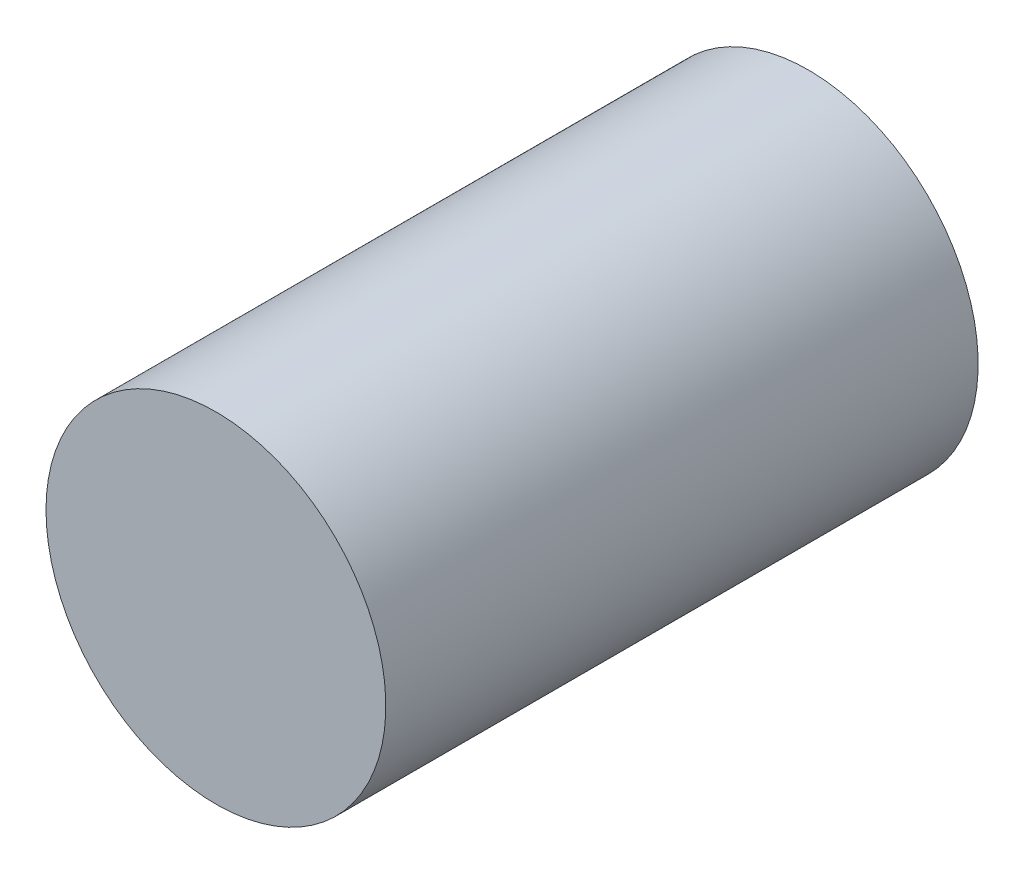
ISO-10303-21;
HEADER;
FILE_DESCRIPTION(('STEP AP214'),'2;1');
FILE_NAME('part.step','',(''),(''),'','','');
FILE_SCHEMA(('AUTOMOTIVE_DESIGN { 1 0 10303 214 1 1 1 1 }'));
ENDSEC;
DATA;
#1=APPLICATION_CONTEXT('core data for automotive mechanical design processes');
#2=APPLICATION_PROTOCOL_DEFINITION('international standard','automotive_design',2000,#1);
#3=PRODUCT_CONTEXT('',#1,'mechanical');
#4=PRODUCT('Part','Part','',(#3));
#5=PRODUCT_RELATED_PRODUCT_CATEGORY('part','',(#4));
#6=PRODUCT_DEFINITION_FORMATION('','',#4);
#7=PRODUCT_DEFINITION_CONTEXT('part definition',#1,'design');
#8=PRODUCT_DEFINITION('design','',#6,#7);
#9=PRODUCT_DEFINITION_SHAPE('','',#8);
#10=(LENGTH_UNIT() NAMED_UNIT(*) SI_UNIT(.MILLI.,.METRE.));
#11=(NAMED_UNIT(*) PLANE_ANGLE_UNIT() SI_UNIT($,.RADIAN.));
#12=(NAMED_UNIT(*) SI_UNIT($,.STERADIAN.) SOLID_ANGLE_UNIT());
#13=UNCERTAINTY_MEASURE_WITH_UNIT(LENGTH_MEASURE(1.E-05),#10,'distance_accuracy_value','');
#14=(GEOMETRIC_REPRESENTATION_CONTEXT(3) GLOBAL_UNCERTAINTY_ASSIGNED_CONTEXT((#13)) GLOBAL_UNIT_ASSIGNED_CONTEXT((#10,
#11,#12)) REPRESENTATION_CONTEXT('',''));
#15=CARTESIAN_POINT('',(0.,0.,0.));
#16=DIRECTION('',(0.,0.,1.));
#17=DIRECTION('',(1.,0.,0.));
#18=AXIS2_PLACEMENT_3D('',#15,#16,#17);
#19=CARTESIAN_POINT('',(0.,0.,61.0108));
#20=DIRECTION('',(0.,0.,-1.));
#21=DIRECTION('',(-1.,0.,0.));
#22=AXIS2_PLACEMENT_3D('',#19,#20,#21);
#23=CYLINDRICAL_SURFACE('',#22,17.5006);
#24=CARTESIAN_POINT('',(0.,0.,61.0108));
#25=DIRECTION('',(0.,0.,1.));
#26=DIRECTION('',(1.,0.,0.));
#27=AXIS2_PLACEMENT_3D('',#24,#25,#26);
#28=CIRCLE('',#27,17.5006);
#29=CARTESIAN_POINT('',(-17.5006,0.,61.0108));
#30=VERTEX_POINT('',#29);
#31=EDGE_CURVE('E10',#30,#30,#28,.T.);
#32=CARTESIAN_POINT('',(0.,0.,0.));
#33=DIRECTION('',(0.,0.,1.));
#34=DIRECTION('',(1.,0.,0.));
#35=AXIS2_PLACEMENT_3D('',#32,#33,#34);
#36=CIRCLE('',#35,17.5006);
#37=CARTESIAN_POINT('',(-17.5006,0.,0.));
#38=VERTEX_POINT('',#37);
#39=EDGE_CURVE('E43',#38,#38,#36,.T.);
#40=CARTESIAN_POINT('',(-17.5006,0.,61.0108));
#41=CARTESIAN_POINT('',(-17.5006,0.,60.3752708333333));
#42=CARTESIAN_POINT('',(-17.5006,0.,59.7397416666667));
#43=CARTESIAN_POINT('',(-17.5006,0.,58.4686833333333));
#44=CARTESIAN_POINT('',(-17.5006,0.,57.8331541666667));
#45=CARTESIAN_POINT('',(-17.5006,0.,56.5620958333333));
#46=CARTESIAN_POINT('',(-17.5006,0.,55.9265666666667));
#47=CARTESIAN_POINT('',(-17.5006,0.,54.6555083333333));
#48=CARTESIAN_POINT('',(-17.5006,0.,54.0199791666667));
#49=CARTESIAN_POINT('',(-17.5006,0.,52.7489208333333));
#50=CARTESIAN_POINT('',(-17.5006,0.,52.1133916666667));
#51=CARTESIAN_POINT('',(-17.5006,0.,50.8423333333333));
#52=CARTESIAN_POINT('',(-17.5006,0.,50.2068041666667));
#53=CARTESIAN_POINT('',(-17.5006,0.,48.9357458333333));
#54=CARTESIAN_POINT('',(-17.5006,0.,48.3002166666667));
#55=CARTESIAN_POINT('',(-17.5006,0.,47.0291583333333));
#56=CARTESIAN_POINT('',(-17.5006,0.,46.3936291666667));
#57=CARTESIAN_POINT('',(-17.5006,0.,45.1225708333333));
#58=CARTESIAN_POINT('',(-17.5006,0.,44.4870416666667));
#59=CARTESIAN_POINT('',(-17.5006,0.,43.2159833333333));
#60=CARTESIAN_POINT('',(-17.5006,0.,42.5804541666667));
#61=CARTESIAN_POINT('',(-17.5006,0.,41.3093958333333));
#62=CARTESIAN_POINT('',(-17.5006,0.,40.6738666666667));
#63=CARTESIAN_POINT('',(-17.5006,0.,39.4028083333333));
#64=CARTESIAN_POINT('',(-17.5006,0.,38.7672791666667));
#65=CARTESIAN_POINT('',(-17.5006,0.,37.4962208333333));
#66=CARTESIAN_POINT('',(-17.5006,0.,36.8606916666667));
#67=CARTESIAN_POINT('',(-17.5006,0.,35.5896333333333));
#68=CARTESIAN_POINT('',(-17.5006,0.,34.9541041666667));
#69=CARTESIAN_POINT('',(-17.5006,0.,33.6830458333333));
#70=CARTESIAN_POINT('',(-17.5006,0.,33.0475166666667));
#71=CARTESIAN_POINT('',(-17.5006,0.,31.7764583333333));
#72=CARTESIAN_POINT('',(-17.5006,0.,31.1409291666667));
#73=CARTESIAN_POINT('',(-17.5006,0.,29.8698708333333));
#74=CARTESIAN_POINT('',(-17.5006,0.,29.2343416666667));
#75=CARTESIAN_POINT('',(-17.5006,0.,27.9632833333333));
#76=CARTESIAN_POINT('',(-17.5006,0.,27.3277541666667));
#77=CARTESIAN_POINT('',(-17.5006,0.,26.0566958333333));
#78=CARTESIAN_POINT('',(-17.5006,0.,25.4211666666667));
#79=CARTESIAN_POINT('',(-17.5006,0.,24.1501083333333));
#80=CARTESIAN_POINT('',(-17.5006,0.,23.5145791666667));
#81=CARTESIAN_POINT('',(-17.5006,0.,22.2435208333333));
#82=CARTESIAN_POINT('',(-17.5006,0.,21.6079916666667));
#83=CARTESIAN_POINT('',(-17.5006,0.,20.3369333333333));
#84=CARTESIAN_POINT('',(-17.5006,0.,19.7014041666667));
#85=CARTESIAN_POINT('',(-17.5006,0.,18.4303458333333));
#86=CARTESIAN_POINT('',(-17.5006,0.,17.7948166666667));
#87=CARTESIAN_POINT('',(-17.5006,0.,16.5237583333333));
#88=CARTESIAN_POINT('',(-17.5006,0.,15.8882291666667));
#89=CARTESIAN_POINT('',(-17.5006,0.,14.6171708333333));
#90=CARTESIAN_POINT('',(-17.5006,0.,13.9816416666667));
#91=CARTESIAN_POINT('',(-17.5006,0.,12.7105833333333));
#92=CARTESIAN_POINT('',(-17.5006,0.,12.0750541666667));
#93=CARTESIAN_POINT('',(-17.5006,0.,10.8039958333333));
#94=CARTESIAN_POINT('',(-17.5006,0.,10.1684666666667));
#95=CARTESIAN_POINT('',(-17.5006,0.,8.89740833333333));
#96=CARTESIAN_POINT('',(-17.5006,0.,8.26187916666666));
#97=CARTESIAN_POINT('',(-17.5006,0.,6.99082083333333));
#98=CARTESIAN_POINT('',(-17.5006,0.,6.35529166666666));
#99=CARTESIAN_POINT('',(-17.5006,0.,5.08423333333333));
#100=CARTESIAN_POINT('',(-17.5006,0.,4.44870416666666));
#101=CARTESIAN_POINT('',(-17.5006,0.,3.17764583333333));
#102=CARTESIAN_POINT('',(-17.5006,0.,2.54211666666666));
#103=CARTESIAN_POINT('',(-17.5006,0.,1.27105833333333));
#104=CARTESIAN_POINT('',(-17.5006,0.,0.635529166666659));
#105=CARTESIAN_POINT('',(-17.5006,0.,0.));
#106=B_SPLINE_CURVE_WITH_KNOTS('',3,(#40,#41,#42,#43,#44,#45,#46,#47,#48,#49,#50,#51,#52,#53,
#54,#55,#56,#57,#58,#59,#60,#61,#62,#63,#64,#65,#66,#67,#68,#69,#70,#71,#72,#73,#74,#75,#76,#77,
#78,#79,#80,#81,#82,#83,#84,#85,#86,#87,#88,#89,#90,#91,#92,#93,#94,#95,#96,#97,#98,#99,#100,
#101,#102,#103,#104,#105),.UNSPECIFIED.,.F.,.F.,(4,2,2,2,2,2,2,2,2,2,2,2,2,2,2,2,2,2,2,2,2,2,2,
2,2,2,2,2,2,2,2,2,4),(0.,1.9065875,3.813175,5.7197625,7.62635,9.5329375,11.439525,13.3461125,
15.2527,17.1592875,19.065875,20.9724625,22.87905,24.7856375,26.692225,28.5988125,30.5054,
32.4119875,34.318575,36.2251625,38.13175,40.0383375,41.944925,43.8515125,45.7581,47.6646875,
49.571275,51.4778625,53.38445,55.2910375,57.197625,59.1042125,61.0108),.UNSPECIFIED.);
#107=EDGE_CURVE('BSEAM40',#30,#38,#106,.T.);
#108=ORIENTED_EDGE('',*,*,#31,.F.);
#109=ORIENTED_EDGE('',*,*,#39,.T.);
#110=ORIENTED_EDGE('',*,*,#107,.T.);
#111=ORIENTED_EDGE('',*,*,#107,.F.);
#112=EDGE_LOOP('',(#108,#110,#109,#111));
#113=FACE_BOUND('',#112,.T.);
#114=ADVANCED_FACE('F40',(#113),#23,.T.);
#115=CARTESIAN_POINT('',(0.,0.,61.0108));
#116=DIRECTION('',(0.,0.,1.));
#117=DIRECTION('',(1.,0.,0.));
#118=AXIS2_PLACEMENT_3D('',#115,#116,#117);
#119=PLANE('',#118);
#120=ORIENTED_EDGE('',*,*,#31,.T.);
#121=EDGE_LOOP('',(#120));
#122=FACE_BOUND('',#121,.T.);
#123=ADVANCED_FACE('F57',(#122),#119,.T.);
#124=CARTESIAN_POINT('',(0.,0.,0.));
#125=DIRECTION('',(0.,0.,1.));
#126=DIRECTION('',(1.,0.,0.));
#127=AXIS2_PLACEMENT_3D('',#124,#125,#126);
#128=PLANE('',#127);
#129=ORIENTED_EDGE('',*,*,#39,.F.);
#130=EDGE_LOOP('',(#129));
#131=FACE_BOUND('',#130,.T.);
#132=ADVANCED_FACE('F55',(#131),#128,.F.);
#133=CLOSED_SHELL('',(#114,#123,#132));
#134=MANIFOLD_SOLID_BREP('B2',#133);
#135=ADVANCED_BREP_SHAPE_REPRESENTATION('',(#18,#134),#14);
#136=SHAPE_DEFINITION_REPRESENTATION(#9,#135);
ENDSEC;
END-ISO-10303-21;
